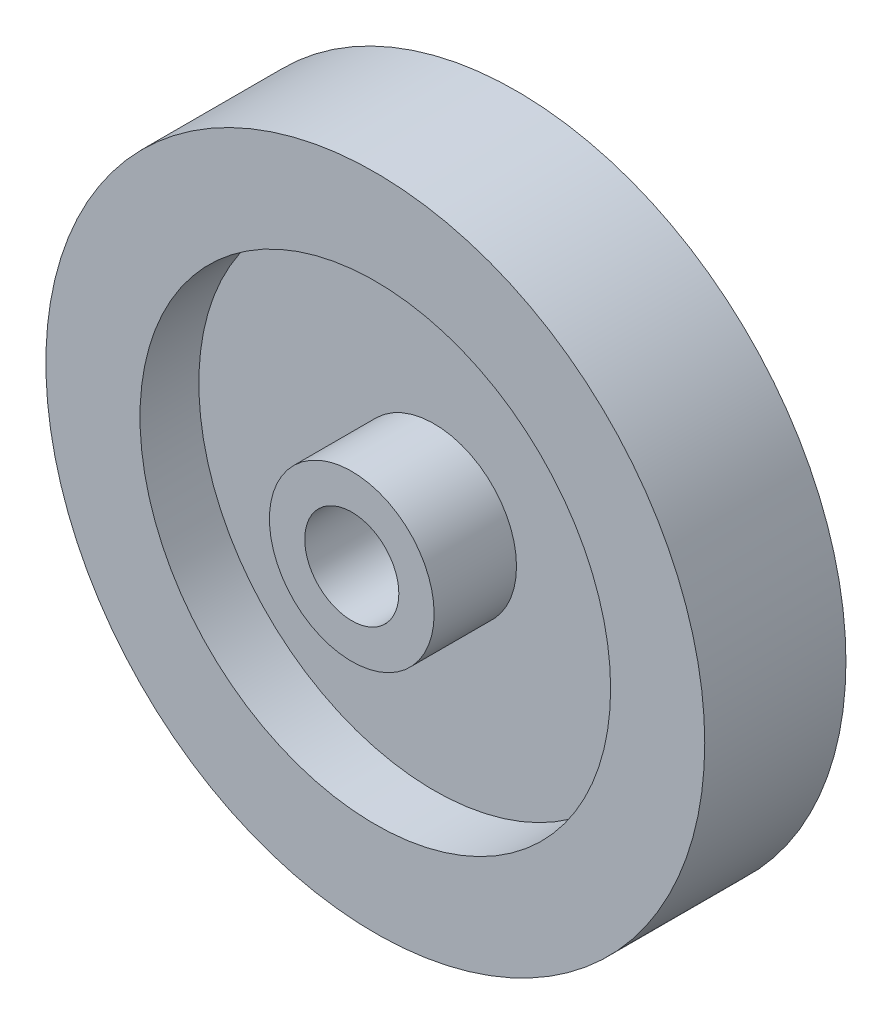
ISO-10303-21;
HEADER;
FILE_DESCRIPTION(('STEP AP214'),'2;1');
FILE_NAME('part.step','',(''),(''),'','','');
FILE_SCHEMA(('AUTOMOTIVE_DESIGN { 1 0 10303 214 1 1 1 1 }'));
ENDSEC;
DATA;
#1=APPLICATION_CONTEXT('core data for automotive mechanical design processes');
#2=APPLICATION_PROTOCOL_DEFINITION('international standard','automotive_design',2000,#1);
#3=PRODUCT_CONTEXT('',#1,'mechanical');
#4=PRODUCT('Part','Part','',(#3));
#5=PRODUCT_RELATED_PRODUCT_CATEGORY('part','',(#4));
#6=PRODUCT_DEFINITION_FORMATION('','',#4);
#7=PRODUCT_DEFINITION_CONTEXT('part definition',#1,'design');
#8=PRODUCT_DEFINITION('design','',#6,#7);
#9=PRODUCT_DEFINITION_SHAPE('','',#8);
#10=(LENGTH_UNIT() NAMED_UNIT(*) SI_UNIT(.MILLI.,.METRE.));
#11=(NAMED_UNIT(*) PLANE_ANGLE_UNIT() SI_UNIT($,.RADIAN.));
#12=(NAMED_UNIT(*) SI_UNIT($,.STERADIAN.) SOLID_ANGLE_UNIT());
#13=UNCERTAINTY_MEASURE_WITH_UNIT(LENGTH_MEASURE(1.E-05),#10,'distance_accuracy_value','');
#14=(GEOMETRIC_REPRESENTATION_CONTEXT(3) GLOBAL_UNCERTAINTY_ASSIGNED_CONTEXT((#13)) GLOBAL_UNIT_ASSIGNED_CONTEXT((#10,
#11,#12)) REPRESENTATION_CONTEXT('',''));
#15=CARTESIAN_POINT('',(0.,0.,0.));
#16=DIRECTION('',(0.,0.,1.));
#17=DIRECTION('',(1.,0.,0.));
#18=AXIS2_PLACEMENT_3D('',#15,#16,#17);
#19=CARTESIAN_POINT('',(0.,0.,0.));
#20=DIRECTION('',(0.,0.,1.));
#21=DIRECTION('',(1.,0.,0.));
#22=AXIS2_PLACEMENT_3D('',#19,#20,#21);
#23=CYLINDRICAL_SURFACE('',#22,22.225);
#24=CARTESIAN_POINT('',(0.,0.,-3.175));
#25=DIRECTION('',(0.,0.,1.));
#26=DIRECTION('',(1.,0.,0.));
#27=AXIS2_PLACEMENT_3D('',#24,#25,#26);
#28=CIRCLE('',#27,22.225);
#29=CARTESIAN_POINT('',(22.225,0.,-3.175));
#30=VERTEX_POINT('',#29);
#31=EDGE_CURVE('E10',#30,#30,#28,.T.);
#32=ORIENTED_EDGE('',*,*,#31,.F.);
#33=EDGE_LOOP('',(#32));
#34=FACE_BOUND('',#33,.T.);
#35=CARTESIAN_POINT('',(0.,0.,-25.4));
#36=DIRECTION('',(0.,0.,1.));
#37=DIRECTION('',(1.,0.,0.));
#38=AXIS2_PLACEMENT_3D('',#35,#36,#37);
#39=CIRCLE('',#38,22.225);
#40=CARTESIAN_POINT('',(22.225,0.,-25.4));
#41=VERTEX_POINT('',#40);
#42=EDGE_CURVE('E77',#41,#41,#39,.T.);
#43=ORIENTED_EDGE('',*,*,#42,.T.);
#44=EDGE_LOOP('',(#43));
#45=FACE_BOUND('',#44,.T.);
#46=ADVANCED_FACE('F37',(#34,#45),#23,.T.);
#47=CARTESIAN_POINT('',(0.,22.225,-3.175));
#48=DIRECTION('',(0.,0.,1.));
#49=DIRECTION('',(1.,0.,0.));
#50=AXIS2_PLACEMENT_3D('',#47,#48,#49);
#51=PLANE('',#50);
#52=CARTESIAN_POINT('',(0.,0.,-3.175));
#53=DIRECTION('',(0.,0.,1.));
#54=DIRECTION('',(1.,0.,0.));
#55=AXIS2_PLACEMENT_3D('',#52,#53,#54);
#56=CIRCLE('',#55,63.5);
#57=CARTESIAN_POINT('',(63.5,0.,-3.175));
#58=VERTEX_POINT('',#57);
#59=EDGE_CURVE('E43',#58,#58,#56,.T.);
#60=ORIENTED_EDGE('',*,*,#59,.F.);
#61=EDGE_LOOP('',(#60));
#62=FACE_BOUND('',#61,.T.);
#63=ORIENTED_EDGE('',*,*,#31,.T.);
#64=EDGE_LOOP('',(#63));
#65=FACE_BOUND('',#64,.T.);
#66=ADVANCED_FACE('F149',(#62,#65),#51,.F.);
#67=CARTESIAN_POINT('',(0.,0.,0.));
#68=DIRECTION('',(0.,0.,1.));
#69=DIRECTION('',(1.,0.,0.));
#70=AXIS2_PLACEMENT_3D('',#67,#68,#69);
#71=CYLINDRICAL_SURFACE('',#70,63.5);
#72=CARTESIAN_POINT('',(0.,0.,-19.05));
#73=DIRECTION('',(0.,0.,1.));
#74=DIRECTION('',(1.,0.,0.));
#75=AXIS2_PLACEMENT_3D('',#72,#73,#74);
#76=CIRCLE('',#75,63.5);
#77=CARTESIAN_POINT('',(63.5,0.,-19.05));
#78=VERTEX_POINT('',#77);
#79=EDGE_CURVE('E47',#78,#78,#76,.T.);
#80=ORIENTED_EDGE('',*,*,#79,.F.);
#81=EDGE_LOOP('',(#80));
#82=FACE_BOUND('',#81,.T.);
#83=ORIENTED_EDGE('',*,*,#59,.T.);
#84=EDGE_LOOP('',(#83));
#85=FACE_BOUND('',#84,.T.);
#86=ADVANCED_FACE('F146',(#82,#85),#71,.F.);
#87=CARTESIAN_POINT('',(0.,88.9,-19.05));
#88=DIRECTION('',(0.,0.,1.));
#89=DIRECTION('',(1.,0.,0.));
#90=AXIS2_PLACEMENT_3D('',#87,#88,#89);
#91=PLANE('',#90);
#92=CARTESIAN_POINT('',(0.,0.,-19.05));
#93=DIRECTION('',(0.,0.,1.));
#94=DIRECTION('',(1.,0.,0.));
#95=AXIS2_PLACEMENT_3D('',#92,#93,#94);
#96=CIRCLE('',#95,88.9);
#97=CARTESIAN_POINT('',(88.9,0.,-19.05));
#98=VERTEX_POINT('',#97);
#99=EDGE_CURVE('E51',#98,#98,#96,.T.);
#100=ORIENTED_EDGE('',*,*,#99,.F.);
#101=EDGE_LOOP('',(#100));
#102=FACE_BOUND('',#101,.T.);
#103=ORIENTED_EDGE('',*,*,#79,.T.);
#104=EDGE_LOOP('',(#103));
#105=FACE_BOUND('',#104,.T.);
#106=ADVANCED_FACE('F142',(#102,#105),#91,.F.);
#107=CARTESIAN_POINT('',(0.,0.,0.));
#108=DIRECTION('',(0.,0.,1.));
#109=DIRECTION('',(1.,0.,0.));
#110=AXIS2_PLACEMENT_3D('',#107,#108,#109);
#111=CYLINDRICAL_SURFACE('',#110,88.9);
#112=CARTESIAN_POINT('',(0.,0.,19.05));
#113=DIRECTION('',(0.,0.,1.));
#114=DIRECTION('',(1.,0.,0.));
#115=AXIS2_PLACEMENT_3D('',#112,#113,#114);
#116=CIRCLE('',#115,88.9);
#117=CARTESIAN_POINT('',(88.9,0.,19.05));
#118=VERTEX_POINT('',#117);
#119=EDGE_CURVE('E56',#118,#118,#116,.T.);
#120=ORIENTED_EDGE('',*,*,#119,.F.);
#121=EDGE_LOOP('',(#120));
#122=FACE_BOUND('',#121,.T.);
#123=ORIENTED_EDGE('',*,*,#99,.T.);
#124=EDGE_LOOP('',(#123));
#125=FACE_BOUND('',#124,.T.);
#126=ADVANCED_FACE('F138',(#122,#125),#111,.T.);
#127=CARTESIAN_POINT('',(0.,88.9,19.05));
#128=DIRECTION('',(0.,0.,-1.));
#129=DIRECTION('',(-1.,0.,0.));
#130=AXIS2_PLACEMENT_3D('',#127,#128,#129);
#131=PLANE('',#130);
#132=CARTESIAN_POINT('',(0.,0.,19.05));
#133=DIRECTION('',(0.,0.,1.));
#134=DIRECTION('',(1.,0.,0.));
#135=AXIS2_PLACEMENT_3D('',#132,#133,#134);
#136=CIRCLE('',#135,63.5);
#137=CARTESIAN_POINT('',(63.5,0.,19.05));
#138=VERTEX_POINT('',#137);
#139=EDGE_CURVE('E59',#138,#138,#136,.T.);
#140=ORIENTED_EDGE('',*,*,#139,.F.);
#141=EDGE_LOOP('',(#140));
#142=FACE_BOUND('',#141,.T.);
#143=ORIENTED_EDGE('',*,*,#119,.T.);
#144=EDGE_LOOP('',(#143));
#145=FACE_BOUND('',#144,.T.);
#146=ADVANCED_FACE('F134',(#142,#145),#131,.F.);
#147=CARTESIAN_POINT('',(0.,0.,0.));
#148=DIRECTION('',(0.,0.,1.));
#149=DIRECTION('',(1.,0.,0.));
#150=AXIS2_PLACEMENT_3D('',#147,#148,#149);
#151=CYLINDRICAL_SURFACE('',#150,63.5);
#152=CARTESIAN_POINT('',(0.,0.,3.175));
#153=DIRECTION('',(0.,0.,1.));
#154=DIRECTION('',(1.,0.,0.));
#155=AXIS2_PLACEMENT_3D('',#152,#153,#154);
#156=CIRCLE('',#155,63.5);
#157=CARTESIAN_POINT('',(63.5,0.,3.175));
#158=VERTEX_POINT('',#157);
#159=EDGE_CURVE('E62',#158,#158,#156,.T.);
#160=ORIENTED_EDGE('',*,*,#159,.F.);
#161=EDGE_LOOP('',(#160));
#162=FACE_BOUND('',#161,.T.);
#163=ORIENTED_EDGE('',*,*,#139,.T.);
#164=EDGE_LOOP('',(#163));
#165=FACE_BOUND('',#164,.T.);
#166=ADVANCED_FACE('F130',(#162,#165),#151,.F.);
#167=CARTESIAN_POINT('',(0.,22.225,3.175));
#168=DIRECTION('',(0.,0.,-1.));
#169=DIRECTION('',(-1.,0.,0.));
#170=AXIS2_PLACEMENT_3D('',#167,#168,#169);
#171=PLANE('',#170);
#172=CARTESIAN_POINT('',(0.,0.,3.175));
#173=DIRECTION('',(0.,0.,1.));
#174=DIRECTION('',(1.,0.,0.));
#175=AXIS2_PLACEMENT_3D('',#172,#173,#174);
#176=CIRCLE('',#175,22.225);
#177=CARTESIAN_POINT('',(22.225,0.,3.175));
#178=VERTEX_POINT('',#177);
#179=EDGE_CURVE('E65',#178,#178,#176,.T.);
#180=ORIENTED_EDGE('',*,*,#179,.F.);
#181=EDGE_LOOP('',(#180));
#182=FACE_BOUND('',#181,.T.);
#183=ORIENTED_EDGE('',*,*,#159,.T.);
#184=EDGE_LOOP('',(#183));
#185=FACE_BOUND('',#184,.T.);
#186=ADVANCED_FACE('F126',(#182,#185),#171,.F.);
#187=CARTESIAN_POINT('',(0.,0.,0.));
#188=DIRECTION('',(0.,0.,1.));
#189=DIRECTION('',(1.,0.,0.));
#190=AXIS2_PLACEMENT_3D('',#187,#188,#189);
#191=CYLINDRICAL_SURFACE('',#190,22.225);
#192=CARTESIAN_POINT('',(0.,0.,25.4));
#193=DIRECTION('',(0.,0.,1.));
#194=DIRECTION('',(1.,0.,0.));
#195=AXIS2_PLACEMENT_3D('',#192,#193,#194);
#196=CIRCLE('',#195,22.225);
#197=CARTESIAN_POINT('',(22.225,0.,25.4));
#198=VERTEX_POINT('',#197);
#199=EDGE_CURVE('E68',#198,#198,#196,.T.);
#200=ORIENTED_EDGE('',*,*,#199,.F.);
#201=EDGE_LOOP('',(#200));
#202=FACE_BOUND('',#201,.T.);
#203=ORIENTED_EDGE('',*,*,#179,.T.);
#204=EDGE_LOOP('',(#203));
#205=FACE_BOUND('',#204,.T.);
#206=ADVANCED_FACE('F122',(#202,#205),#191,.T.);
#207=CARTESIAN_POINT('',(0.,12.7,25.4));
#208=DIRECTION('',(0.,0.,-1.));
#209=DIRECTION('',(-1.,0.,0.));
#210=AXIS2_PLACEMENT_3D('',#207,#208,#209);
#211=PLANE('',#210);
#212=CARTESIAN_POINT('',(0.,0.,25.4));
#213=DIRECTION('',(0.,0.,1.));
#214=DIRECTION('',(1.,0.,0.));
#215=AXIS2_PLACEMENT_3D('',#212,#213,#214);
#216=CIRCLE('',#215,12.7);
#217=CARTESIAN_POINT('',(12.7,0.,25.4));
#218=VERTEX_POINT('',#217);
#219=EDGE_CURVE('E71',#218,#218,#216,.T.);
#220=ORIENTED_EDGE('',*,*,#219,.F.);
#221=EDGE_LOOP('',(#220));
#222=FACE_BOUND('',#221,.T.);
#223=ORIENTED_EDGE('',*,*,#199,.T.);
#224=EDGE_LOOP('',(#223));
#225=FACE_BOUND('',#224,.T.);
#226=ADVANCED_FACE('F118',(#222,#225),#211,.F.);
#227=CARTESIAN_POINT('',(0.,0.,0.));
#228=DIRECTION('',(0.,0.,1.));
#229=DIRECTION('',(1.,0.,0.));
#230=AXIS2_PLACEMENT_3D('',#227,#228,#229);
#231=CYLINDRICAL_SURFACE('',#230,12.7);
#232=CARTESIAN_POINT('',(0.,0.,-25.4));
#233=DIRECTION('',(0.,0.,1.));
#234=DIRECTION('',(1.,0.,0.));
#235=AXIS2_PLACEMENT_3D('',#232,#233,#234);
#236=CIRCLE('',#235,12.7);
#237=CARTESIAN_POINT('',(12.7,0.,-25.4));
#238=VERTEX_POINT('',#237);
#239=EDGE_CURVE('E74',#238,#238,#236,.T.);
#240=ORIENTED_EDGE('',*,*,#239,.F.);
#241=EDGE_LOOP('',(#240));
#242=FACE_BOUND('',#241,.T.);
#243=ORIENTED_EDGE('',*,*,#219,.T.);
#244=EDGE_LOOP('',(#243));
#245=FACE_BOUND('',#244,.T.);
#246=ADVANCED_FACE('F114',(#242,#245),#231,.F.);
#247=CARTESIAN_POINT('',(0.,12.7,-25.4));
#248=DIRECTION('',(0.,0.,1.));
#249=DIRECTION('',(1.,0.,0.));
#250=AXIS2_PLACEMENT_3D('',#247,#248,#249);
#251=PLANE('',#250);
#252=ORIENTED_EDGE('',*,*,#42,.F.);
#253=EDGE_LOOP('',(#252));
#254=FACE_BOUND('',#253,.T.);
#255=ORIENTED_EDGE('',*,*,#239,.T.);
#256=EDGE_LOOP('',(#255));
#257=FACE_BOUND('',#256,.T.);
#258=ADVANCED_FACE('F112',(#254,#257),#251,.F.);
#259=CLOSED_SHELL('',(#46,#66,#86,#106,#126,#146,#166,#186,#206,#226,#246,#258));
#260=CARTESIAN_POINT('',(0.,0.,0.));
#261=DIRECTION('',(0.,0.,1.));
#262=DIRECTION('',(1.,0.,0.));
#263=AXIS2_PLACEMENT_3D('',#260,#261,#262);
#264=CYLINDRICAL_SURFACE('',#263,88.6870290244375);
#265=CARTESIAN_POINT('',(0.,0.,10.9724219751807));
#266=DIRECTION('',(0.,0.,1.));
#267=DIRECTION('',(1.,0.,0.));
#268=AXIS2_PLACEMENT_3D('',#265,#266,#267);
#269=CIRCLE('',#268,88.6870290244375);
#270=CARTESIAN_POINT('',(88.6870290244375,0.,10.9724219751807));
#271=VERTEX_POINT('',#270);
#272=EDGE_CURVE('E80',#271,#271,#269,.T.);
#273=ORIENTED_EDGE('',*,*,#272,.T.);
#274=EDGE_LOOP('',(#273));
#275=FACE_BOUND('',#274,.T.);
#276=CARTESIAN_POINT('',(0.,0.,-10.9724219751807));
#277=DIRECTION('',(0.,0.,1.));
#278=DIRECTION('',(1.,0.,0.));
#279=AXIS2_PLACEMENT_3D('',#276,#277,#278);
#280=CIRCLE('',#279,88.6870290244375);
#281=CARTESIAN_POINT('',(88.6870290244375,0.,-10.9724219751807));
#282=VERTEX_POINT('',#281);
#283=EDGE_CURVE('E89',#282,#282,#280,.T.);
#284=ORIENTED_EDGE('',*,*,#283,.F.);
#285=EDGE_LOOP('',(#284));
#286=FACE_BOUND('',#285,.T.);
#287=ADVANCED_FACE('F96',(#275,#286),#264,.F.);
#288=CARTESIAN_POINT('',(0.,0.,10.9724219751807));
#289=DIRECTION('',(0.,0.,1.));
#290=DIRECTION('',(1.,0.,0.));
#291=AXIS2_PLACEMENT_3D('',#288,#289,#290);
#292=CONICAL_SURFACE('',#291,88.6870290244375,1.22173047639603);
#293=CARTESIAN_POINT('',(0.,0.,6.35));
#294=DIRECTION('',(0.,0.,1.));
#295=DIRECTION('',(1.,0.,0.));
#296=AXIS2_PLACEMENT_3D('',#293,#294,#295);
#297=CIRCLE('',#296,75.9870290244375);
#298=CARTESIAN_POINT('',(75.9870290244375,0.,6.35));
#299=VERTEX_POINT('',#298);
#300=EDGE_CURVE('E83',#299,#299,#297,.T.);
#301=ORIENTED_EDGE('',*,*,#300,.T.);
#302=EDGE_LOOP('',(#301));
#303=FACE_BOUND('',#302,.T.);
#304=ORIENTED_EDGE('',*,*,#272,.F.);
#305=EDGE_LOOP('',(#304));
#306=FACE_BOUND('',#305,.T.);
#307=ADVANCED_FACE('F98',(#303,#306),#292,.T.);
#308=CARTESIAN_POINT('',(0.,0.,0.));
#309=DIRECTION('',(0.,0.,1.));
#310=DIRECTION('',(1.,0.,0.));
#311=AXIS2_PLACEMENT_3D('',#308,#309,#310);
#312=CYLINDRICAL_SURFACE('',#311,75.9870290244375);
#313=CARTESIAN_POINT('',(0.,0.,-6.35));
#314=DIRECTION('',(0.,0.,1.));
#315=DIRECTION('',(1.,0.,0.));
#316=AXIS2_PLACEMENT_3D('',#313,#314,#315);
#317=CIRCLE('',#316,75.9870290244375);
#318=CARTESIAN_POINT('',(75.9870290244375,0.,-6.35));
#319=VERTEX_POINT('',#318);
#320=EDGE_CURVE('E86',#319,#319,#317,.T.);
#321=ORIENTED_EDGE('',*,*,#320,.T.);
#322=EDGE_LOOP('',(#321));
#323=FACE_BOUND('',#322,.T.);
#324=ORIENTED_EDGE('',*,*,#300,.F.);
#325=EDGE_LOOP('',(#324));
#326=FACE_BOUND('',#325,.T.);
#327=ADVANCED_FACE('F106',(#323,#326),#312,.T.);
#328=CARTESIAN_POINT('',(0.,0.,-6.35));
#329=DIRECTION('',(0.,0.,-1.));
#330=DIRECTION('',(-1.,0.,0.));
#331=AXIS2_PLACEMENT_3D('',#328,#329,#330);
#332=CONICAL_SURFACE('',#331,75.9870290244375,1.22173047639603);
#333=ORIENTED_EDGE('',*,*,#283,.T.);
#334=EDGE_LOOP('',(#333));
#335=FACE_BOUND('',#334,.T.);
#336=ORIENTED_EDGE('',*,*,#320,.F.);
#337=EDGE_LOOP('',(#336));
#338=FACE_BOUND('',#337,.T.);
#339=ADVANCED_FACE('F93',(#335,#338),#332,.T.);
#340=CLOSED_SHELL('',(#287,#307,#327,#339));
#341=ORIENTED_CLOSED_SHELL('',*,#340,.T.);
#342=BREP_WITH_VOIDS('B2',#259,(#341));
#343=ADVANCED_BREP_SHAPE_REPRESENTATION('',(#18,#342),#14);
#344=SHAPE_DEFINITION_REPRESENTATION(#9,#343);
ENDSEC;
END-ISO-10303-21;
